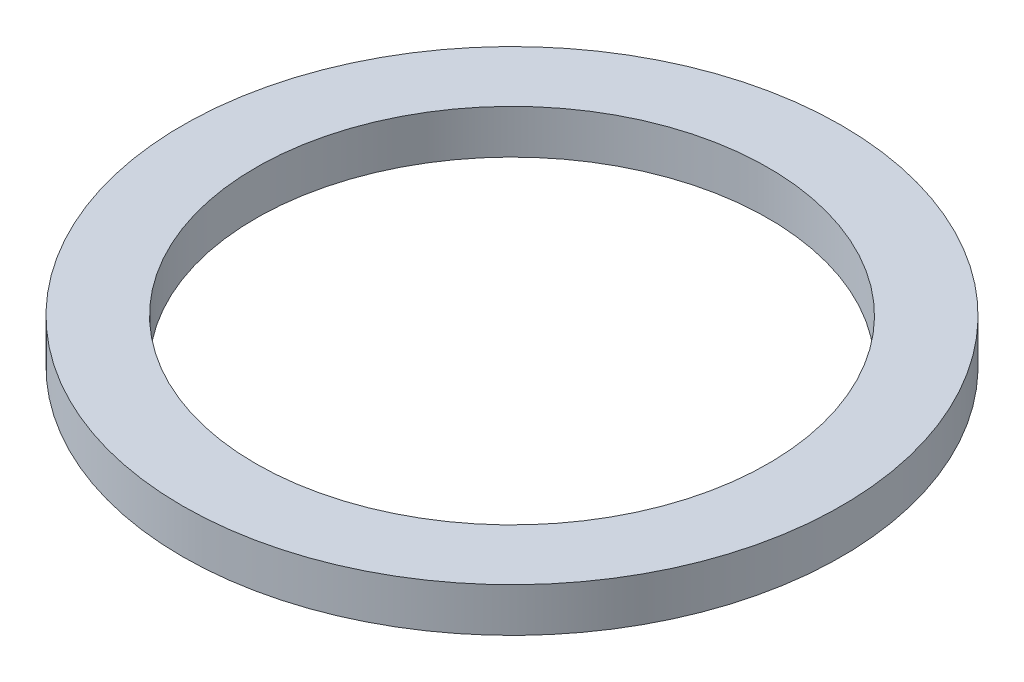
ISO-10303-21;
HEADER;
FILE_DESCRIPTION(('STEP AP214'),'2;1');
FILE_NAME('part.step','',(''),(''),'','','');
FILE_SCHEMA(('AUTOMOTIVE_DESIGN { 1 0 10303 214 1 1 1 1 }'));
ENDSEC;
DATA;
#1=APPLICATION_CONTEXT('core data for automotive mechanical design processes');
#2=APPLICATION_PROTOCOL_DEFINITION('international standard','automotive_design',2000,#1);
#3=PRODUCT_CONTEXT('',#1,'mechanical');
#4=PRODUCT('Part','Part','',(#3));
#5=PRODUCT_RELATED_PRODUCT_CATEGORY('part','',(#4));
#6=PRODUCT_DEFINITION_FORMATION('','',#4);
#7=PRODUCT_DEFINITION_CONTEXT('part definition',#1,'design');
#8=PRODUCT_DEFINITION('design','',#6,#7);
#9=PRODUCT_DEFINITION_SHAPE('','',#8);
#10=(LENGTH_UNIT() NAMED_UNIT(*) SI_UNIT(.MILLI.,.METRE.));
#11=(NAMED_UNIT(*) PLANE_ANGLE_UNIT() SI_UNIT($,.RADIAN.));
#12=(NAMED_UNIT(*) SI_UNIT($,.STERADIAN.) SOLID_ANGLE_UNIT());
#13=UNCERTAINTY_MEASURE_WITH_UNIT(LENGTH_MEASURE(1.E-05),#10,'distance_accuracy_value','');
#14=(GEOMETRIC_REPRESENTATION_CONTEXT(3) GLOBAL_UNCERTAINTY_ASSIGNED_CONTEXT((#13)) GLOBAL_UNIT_ASSIGNED_CONTEXT((#10,
#11,#12)) REPRESENTATION_CONTEXT('',''));
#15=CARTESIAN_POINT('',(0.,0.,0.));
#16=DIRECTION('',(0.,0.,1.));
#17=DIRECTION('',(1.,0.,0.));
#18=AXIS2_PLACEMENT_3D('',#15,#16,#17);
#19=CARTESIAN_POINT('',(0.,3.,0.));
#20=DIRECTION('',(0.,1.,0.));
#21=DIRECTION('',(0.,0.,1.));
#22=AXIS2_PLACEMENT_3D('',#19,#20,#21);
#23=PLANE('',#22);
#24=CARTESIAN_POINT('',(0.,3.,0.));
#25=DIRECTION('',(0.,1.,0.));
#26=DIRECTION('',(0.,0.,1.));
#27=AXIS2_PLACEMENT_3D('',#24,#25,#26);
#28=CIRCLE('',#27,22.5);
#29=CARTESIAN_POINT('',(0.,3.,22.5));
#30=VERTEX_POINT('',#29);
#31=EDGE_CURVE('E10',#30,#30,#28,.T.);
#32=ORIENTED_EDGE('',*,*,#31,.T.);
#33=EDGE_LOOP('',(#32));
#34=FACE_BOUND('',#33,.T.);
#35=CARTESIAN_POINT('',(0.,3.,0.));
#36=DIRECTION('',(0.,1.,0.));
#37=DIRECTION('',(0.,0.,1.));
#38=AXIS2_PLACEMENT_3D('',#35,#36,#37);
#39=CIRCLE('',#38,17.5);
#40=CARTESIAN_POINT('',(0.,3.,17.5));
#41=VERTEX_POINT('',#40);
#42=EDGE_CURVE('E50',#41,#41,#39,.T.);
#43=ORIENTED_EDGE('',*,*,#42,.F.);
#44=EDGE_LOOP('',(#43));
#45=FACE_BOUND('',#44,.T.);
#46=ADVANCED_FACE('F37',(#34,#45),#23,.T.);
#47=CARTESIAN_POINT('',(0.,0.,0.));
#48=DIRECTION('',(0.,1.,0.));
#49=DIRECTION('',(0.,0.,1.));
#50=AXIS2_PLACEMENT_3D('',#47,#48,#49);
#51=PLANE('',#50);
#52=CARTESIAN_POINT('',(0.,0.,0.));
#53=DIRECTION('',(0.,1.,0.));
#54=DIRECTION('',(0.,0.,1.));
#55=AXIS2_PLACEMENT_3D('',#52,#53,#54);
#56=CIRCLE('',#55,22.5);
#57=CARTESIAN_POINT('',(0.,0.,22.5));
#58=VERTEX_POINT('',#57);
#59=EDGE_CURVE('E41',#58,#58,#56,.T.);
#60=ORIENTED_EDGE('',*,*,#59,.F.);
#61=EDGE_LOOP('',(#60));
#62=FACE_BOUND('',#61,.T.);
#63=CARTESIAN_POINT('',(0.,0.,0.));
#64=DIRECTION('',(0.,1.,0.));
#65=DIRECTION('',(0.,0.,1.));
#66=AXIS2_PLACEMENT_3D('',#63,#64,#65);
#67=CIRCLE('',#66,17.5);
#68=CARTESIAN_POINT('',(0.,0.,17.5));
#69=VERTEX_POINT('',#68);
#70=EDGE_CURVE('E52',#69,#69,#67,.T.);
#71=ORIENTED_EDGE('',*,*,#70,.T.);
#72=EDGE_LOOP('',(#71));
#73=FACE_BOUND('',#72,.T.);
#74=ADVANCED_FACE('F64',(#62,#73),#51,.F.);
#75=CARTESIAN_POINT('',(0.,3.,0.));
#76=DIRECTION('',(0.,-1.,0.));
#77=DIRECTION('',(0.,0.,-1.));
#78=AXIS2_PLACEMENT_3D('',#75,#76,#77);
#79=CYLINDRICAL_SURFACE('',#78,22.5);
#80=ORIENTED_EDGE('',*,*,#31,.F.);
#81=EDGE_LOOP('',(#80));
#82=FACE_BOUND('',#81,.T.);
#83=ORIENTED_EDGE('',*,*,#59,.T.);
#84=EDGE_LOOP('',(#83));
#85=FACE_BOUND('',#84,.T.);
#86=ADVANCED_FACE('F39',(#82,#85),#79,.T.);
#87=CARTESIAN_POINT('',(0.,3.,0.));
#88=DIRECTION('',(0.,-1.,0.));
#89=DIRECTION('',(0.,0.,-1.));
#90=AXIS2_PLACEMENT_3D('',#87,#88,#89);
#91=CYLINDRICAL_SURFACE('',#90,17.5);
#92=ORIENTED_EDGE('',*,*,#42,.T.);
#93=EDGE_LOOP('',(#92));
#94=FACE_BOUND('',#93,.T.);
#95=ORIENTED_EDGE('',*,*,#70,.F.);
#96=EDGE_LOOP('',(#95));
#97=FACE_BOUND('',#96,.T.);
#98=ADVANCED_FACE('F60',(#94,#97),#91,.F.);
#99=CLOSED_SHELL('',(#46,#74,#86,#98));
#100=MANIFOLD_SOLID_BREP('B2',#99);
#101=ADVANCED_BREP_SHAPE_REPRESENTATION('',(#18,#100),#14);
#102=SHAPE_DEFINITION_REPRESENTATION(#9,#101);
ENDSEC;
END-ISO-10303-21;
